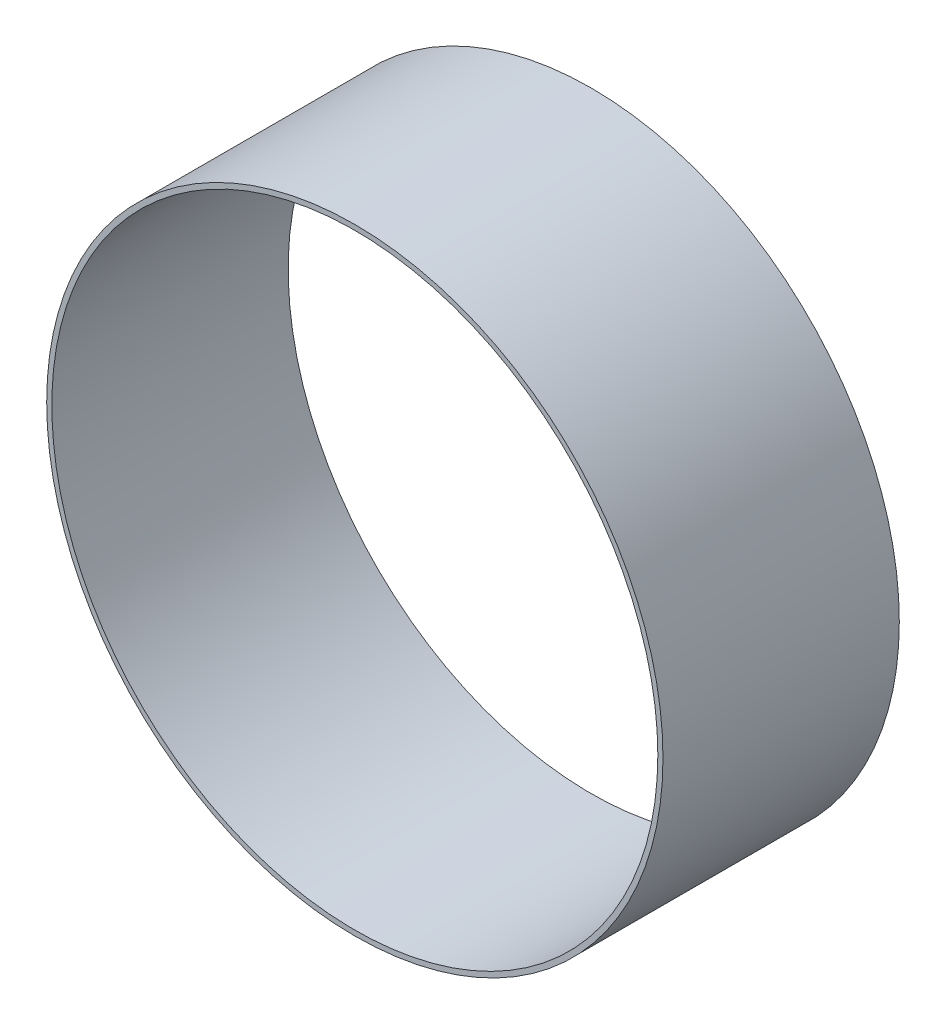
ISO-10303-21;
HEADER;
FILE_DESCRIPTION(('STEP AP214'),'2;1');
FILE_NAME('part.step','',(''),(''),'','','');
FILE_SCHEMA(('AUTOMOTIVE_DESIGN { 1 0 10303 214 1 1 1 1 }'));
ENDSEC;
DATA;
#1=APPLICATION_CONTEXT('core data for automotive mechanical design processes');
#2=APPLICATION_PROTOCOL_DEFINITION('international standard','automotive_design',2000,#1);
#3=PRODUCT_CONTEXT('',#1,'mechanical');
#4=PRODUCT('Part','Part','',(#3));
#5=PRODUCT_RELATED_PRODUCT_CATEGORY('part','',(#4));
#6=PRODUCT_DEFINITION_FORMATION('','',#4);
#7=PRODUCT_DEFINITION_CONTEXT('part definition',#1,'design');
#8=PRODUCT_DEFINITION('design','',#6,#7);
#9=PRODUCT_DEFINITION_SHAPE('','',#8);
#10=(LENGTH_UNIT() NAMED_UNIT(*) SI_UNIT(.MILLI.,.METRE.));
#11=(NAMED_UNIT(*) PLANE_ANGLE_UNIT() SI_UNIT($,.RADIAN.));
#12=(NAMED_UNIT(*) SI_UNIT($,.STERADIAN.) SOLID_ANGLE_UNIT());
#13=UNCERTAINTY_MEASURE_WITH_UNIT(LENGTH_MEASURE(1.E-05),#10,'distance_accuracy_value','');
#14=(GEOMETRIC_REPRESENTATION_CONTEXT(3) GLOBAL_UNCERTAINTY_ASSIGNED_CONTEXT((#13)) GLOBAL_UNIT_ASSIGNED_CONTEXT((#10,
#11,#12)) REPRESENTATION_CONTEXT('',''));
#15=CARTESIAN_POINT('',(0.,0.,0.));
#16=DIRECTION('',(0.,0.,1.));
#17=DIRECTION('',(1.,0.,0.));
#18=AXIS2_PLACEMENT_3D('',#15,#16,#17);
#19=CARTESIAN_POINT('',(0.,0.,0.));
#20=DIRECTION('',(0.,0.,-1.));
#21=DIRECTION('',(1.,0.,0.));
#22=AXIS2_PLACEMENT_3D('',#19,#20,#21);
#23=CYLINDRICAL_SURFACE('',#22,1.52539954);
#24=CARTESIAN_POINT('',(0.,0.,1.17000274));
#25=DIRECTION('',(0.,0.,1.));
#26=DIRECTION('',(1.,0.,0.));
#27=AXIS2_PLACEMENT_3D('',#24,#25,#26);
#28=CIRCLE('',#27,1.52539954);
#29=CARTESIAN_POINT('',(1.52539954,0.,1.17000274));
#30=VERTEX_POINT('',#29);
#31=EDGE_CURVE('E11',#30,#30,#28,.T.);
#32=ORIENTED_EDGE('',*,*,#31,.F.);
#33=DIRECTION('',(0.,0.,1.));
#34=VECTOR('',#33,1.);
#35=CARTESIAN_POINT('',(1.52539954,0.,0.));
#36=LINE('',#35,#34);
#37=CARTESIAN_POINT('',(1.52539954,0.,0.));
#38=VERTEX_POINT('',#37);
#39=EDGE_CURVE('E24',#38,#30,#36,.T.);
#40=ORIENTED_EDGE('',*,*,#39,.F.);
#41=CARTESIAN_POINT('',(0.,0.,0.));
#42=DIRECTION('',(0.,0.,1.));
#43=DIRECTION('',(1.,0.,0.));
#44=AXIS2_PLACEMENT_3D('',#41,#42,#43);
#45=CIRCLE('',#44,1.52539954);
#46=EDGE_CURVE('E46',#38,#38,#45,.T.);
#47=ORIENTED_EDGE('',*,*,#46,.T.);
#48=ORIENTED_EDGE('',*,*,#39,.T.);
#49=EDGE_LOOP('',(#32,#40,#47,#48));
#50=FACE_BOUND('',#49,.T.);
#51=ADVANCED_FACE('F17',(#50),#23,.T.);
#52=CARTESIAN_POINT('',(0.,0.,0.));
#53=DIRECTION('',(0.,0.,-1.));
#54=DIRECTION('',(1.,0.,0.));
#55=AXIS2_PLACEMENT_3D('',#52,#53,#54);
#56=CYLINDRICAL_SURFACE('',#55,1.49999954);
#57=DIRECTION('',(0.,0.,1.));
#58=VECTOR('',#57,1.);
#59=CARTESIAN_POINT('',(1.49999954,0.,0.));
#60=LINE('',#59,#58);
#61=CARTESIAN_POINT('',(1.49999954,0.,0.));
#62=VERTEX_POINT('',#61);
#63=CARTESIAN_POINT('',(1.49999954,0.,1.17000274));
#64=VERTEX_POINT('',#63);
#65=EDGE_CURVE('E40',#62,#64,#60,.T.);
#66=ORIENTED_EDGE('',*,*,#65,.T.);
#67=CARTESIAN_POINT('',(0.,0.,1.17000274));
#68=DIRECTION('',(0.,0.,1.));
#69=DIRECTION('',(1.,0.,0.));
#70=AXIS2_PLACEMENT_3D('',#67,#68,#69);
#71=CIRCLE('',#70,1.49999954);
#72=EDGE_CURVE('E45',#64,#64,#71,.T.);
#73=ORIENTED_EDGE('',*,*,#72,.T.);
#74=ORIENTED_EDGE('',*,*,#65,.F.);
#75=CARTESIAN_POINT('',(0.,0.,0.));
#76=DIRECTION('',(0.,0.,1.));
#77=DIRECTION('',(1.,0.,0.));
#78=AXIS2_PLACEMENT_3D('',#75,#76,#77);
#79=CIRCLE('',#78,1.49999954);
#80=EDGE_CURVE('E43',#62,#62,#79,.T.);
#81=ORIENTED_EDGE('',*,*,#80,.F.);
#82=EDGE_LOOP('',(#66,#73,#74,#81));
#83=FACE_BOUND('',#82,.T.);
#84=ADVANCED_FACE('F42',(#83),#56,.F.);
#85=CARTESIAN_POINT('',(0.,0.,0.));
#86=DIRECTION('',(0.,0.,1.));
#87=DIRECTION('',(1.,0.,0.));
#88=AXIS2_PLACEMENT_3D('',#85,#86,#87);
#89=PLANE('',#88);
#90=ORIENTED_EDGE('',*,*,#46,.F.);
#91=EDGE_LOOP('',(#90));
#92=FACE_BOUND('',#91,.T.);
#93=ORIENTED_EDGE('',*,*,#80,.T.);
#94=EDGE_LOOP('',(#93));
#95=FACE_BOUND('',#94,.T.);
#96=ADVANCED_FACE('F49',(#92,#95),#89,.F.);
#97=CARTESIAN_POINT('',(0.,0.,1.17000274));
#98=DIRECTION('',(0.,0.,1.));
#99=DIRECTION('',(1.,0.,0.));
#100=AXIS2_PLACEMENT_3D('',#97,#98,#99);
#101=PLANE('',#100);
#102=ORIENTED_EDGE('',*,*,#31,.T.);
#103=EDGE_LOOP('',(#102));
#104=FACE_BOUND('',#103,.T.);
#105=ORIENTED_EDGE('',*,*,#72,.F.);
#106=EDGE_LOOP('',(#105));
#107=FACE_BOUND('',#106,.T.);
#108=ADVANCED_FACE('F56',(#104,#107),#101,.T.);
#109=CLOSED_SHELL('',(#51,#84,#96,#108));
#110=MANIFOLD_SOLID_BREP('B1',#109);
#111=ADVANCED_BREP_SHAPE_REPRESENTATION('',(#18,#110),#14);
#112=SHAPE_DEFINITION_REPRESENTATION(#9,#111);
ENDSEC;
END-ISO-10303-21;
